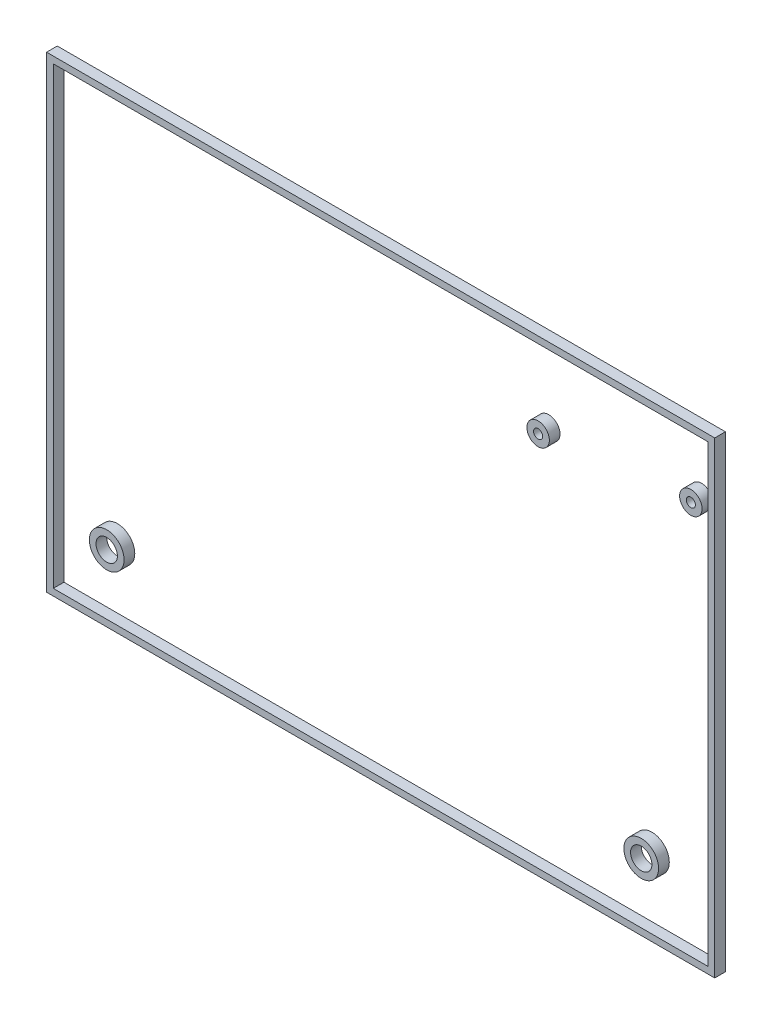
ISO-10303-21;
HEADER;
FILE_DESCRIPTION(('STEP AP214'),'2;1');
FILE_NAME('part.step','',(''),(''),'','','');
FILE_SCHEMA(('AUTOMOTIVE_DESIGN { 1 0 10303 214 1 1 1 1 }'));
ENDSEC;
DATA;
#1=APPLICATION_CONTEXT('core data for automotive mechanical design processes');
#2=APPLICATION_PROTOCOL_DEFINITION('international standard','automotive_design',2000,#1);
#3=PRODUCT_CONTEXT('',#1,'mechanical');
#4=PRODUCT('Part','Part','',(#3));
#5=PRODUCT_RELATED_PRODUCT_CATEGORY('part','',(#4));
#6=PRODUCT_DEFINITION_FORMATION('','',#4);
#7=PRODUCT_DEFINITION_CONTEXT('part definition',#1,'design');
#8=PRODUCT_DEFINITION('design','',#6,#7);
#9=PRODUCT_DEFINITION_SHAPE('','',#8);
#10=(LENGTH_UNIT() NAMED_UNIT(*) SI_UNIT(.MILLI.,.METRE.));
#11=(NAMED_UNIT(*) PLANE_ANGLE_UNIT() SI_UNIT($,.RADIAN.));
#12=(NAMED_UNIT(*) SI_UNIT($,.STERADIAN.) SOLID_ANGLE_UNIT());
#13=UNCERTAINTY_MEASURE_WITH_UNIT(LENGTH_MEASURE(1.E-05),#10,'distance_accuracy_value','');
#14=(GEOMETRIC_REPRESENTATION_CONTEXT(3) GLOBAL_UNCERTAINTY_ASSIGNED_CONTEXT((#13)) GLOBAL_UNIT_ASSIGNED_CONTEXT((#10,
#11,#12)) REPRESENTATION_CONTEXT('',''));
#15=CARTESIAN_POINT('',(0.,0.,0.));
#16=DIRECTION('',(0.,0.,1.));
#17=DIRECTION('',(1.,0.,0.));
#18=AXIS2_PLACEMENT_3D('',#15,#16,#17);
#19=CARTESIAN_POINT('',(115.,-95.,-0.8));
#20=DIRECTION('',(0.,0.,1.));
#21=DIRECTION('',(1.,0.,0.));
#22=AXIS2_PLACEMENT_3D('',#19,#20,#21);
#23=CYLINDRICAL_SURFACE('',#22,1.60000000000001);
#24=CARTESIAN_POINT('',(115.,-95.,-0.8));
#25=DIRECTION('',(0.,0.,1.));
#26=DIRECTION('',(1.,0.,0.));
#27=AXIS2_PLACEMENT_3D('',#24,#25,#26);
#28=CIRCLE('',#27,1.60000000000001);
#29=CARTESIAN_POINT('',(116.6,-95.,-0.8));
#30=VERTEX_POINT('',#29);
#31=EDGE_CURVE('E165',#30,#30,#28,.T.);
#32=ORIENTED_EDGE('',*,*,#31,.F.);
#33=EDGE_LOOP('',(#32));
#34=FACE_BOUND('',#33,.T.);
#35=CARTESIAN_POINT('',(115.,-95.,0.8));
#36=DIRECTION('',(0.,0.,1.));
#37=DIRECTION('',(1.,0.,0.));
#38=AXIS2_PLACEMENT_3D('',#35,#36,#37);
#39=CIRCLE('',#38,1.60000000000001);
#40=CARTESIAN_POINT('',(116.6,-95.,0.8));
#41=VERTEX_POINT('',#40);
#42=EDGE_CURVE('E173',#41,#41,#39,.T.);
#43=ORIENTED_EDGE('',*,*,#42,.T.);
#44=EDGE_LOOP('',(#43));
#45=FACE_BOUND('',#44,.T.);
#46=ADVANCED_FACE('F159',(#34,#45),#23,.F.);
#47=CARTESIAN_POINT('',(115.,-95.,-0.8));
#48=DIRECTION('',(0.,0.,1.));
#49=DIRECTION('',(1.,0.,0.));
#50=AXIS2_PLACEMENT_3D('',#47,#48,#49);
#51=CYLINDRICAL_SURFACE('',#50,2.6);
#52=CARTESIAN_POINT('',(115.,-95.,-0.8));
#53=DIRECTION('',(0.,0.,1.));
#54=DIRECTION('',(1.,0.,0.));
#55=AXIS2_PLACEMENT_3D('',#52,#53,#54);
#56=CIRCLE('',#55,2.6);
#57=CARTESIAN_POINT('',(117.6,-95.,-0.8));
#58=VERTEX_POINT('',#57);
#59=EDGE_CURVE('E12',#58,#58,#56,.T.);
#60=ORIENTED_EDGE('',*,*,#59,.T.);
#61=EDGE_LOOP('',(#60));
#62=FACE_BOUND('',#61,.T.);
#63=CARTESIAN_POINT('',(115.,-95.,0.8));
#64=DIRECTION('',(0.,0.,1.));
#65=DIRECTION('',(1.,0.,0.));
#66=AXIS2_PLACEMENT_3D('',#63,#64,#65);
#67=CIRCLE('',#66,2.6);
#68=CARTESIAN_POINT('',(117.6,-95.,0.8));
#69=VERTEX_POINT('',#68);
#70=EDGE_CURVE('E169',#69,#69,#67,.T.);
#71=ORIENTED_EDGE('',*,*,#70,.F.);
#72=EDGE_LOOP('',(#71));
#73=FACE_BOUND('',#72,.T.);
#74=ADVANCED_FACE('F187',(#62,#73),#51,.T.);
#75=CARTESIAN_POINT('',(0.,0.,-0.8));
#76=DIRECTION('',(0.,0.,1.));
#77=DIRECTION('',(1.,0.,0.));
#78=AXIS2_PLACEMENT_3D('',#75,#76,#77);
#79=PLANE('',#78);
#80=ORIENTED_EDGE('',*,*,#31,.T.);
#81=EDGE_LOOP('',(#80));
#82=FACE_BOUND('',#81,.T.);
#83=ORIENTED_EDGE('',*,*,#59,.F.);
#84=EDGE_LOOP('',(#83));
#85=FACE_BOUND('',#84,.T.);
#86=ADVANCED_FACE('F183',(#82,#85),#79,.F.);
#87=CARTESIAN_POINT('',(0.,0.,0.8));
#88=DIRECTION('',(0.,0.,1.));
#89=DIRECTION('',(1.,0.,0.));
#90=AXIS2_PLACEMENT_3D('',#87,#88,#89);
#91=PLANE('',#90);
#92=ORIENTED_EDGE('',*,*,#42,.F.);
#93=EDGE_LOOP('',(#92));
#94=FACE_BOUND('',#93,.T.);
#95=ORIENTED_EDGE('',*,*,#70,.T.);
#96=EDGE_LOOP('',(#95));
#97=FACE_BOUND('',#96,.T.);
#98=ADVANCED_FACE('F180',(#94,#97),#91,.T.);
#99=CLOSED_SHELL('',(#46,#74,#86,#98));
#100=MANIFOLD_SOLID_BREP('B2',#99);
#101=CARTESIAN_POINT('',(195.,-95.,-0.8));
#102=DIRECTION('',(0.,0.,1.));
#103=DIRECTION('',(1.,0.,0.));
#104=AXIS2_PLACEMENT_3D('',#101,#102,#103);
#105=CYLINDRICAL_SURFACE('',#104,1.59999999999999);
#106=CARTESIAN_POINT('',(195.,-95.,-0.8));
#107=DIRECTION('',(0.,0.,1.));
#108=DIRECTION('',(1.,0.,0.));
#109=AXIS2_PLACEMENT_3D('',#106,#107,#108);
#110=CIRCLE('',#109,1.59999999999999);
#111=CARTESIAN_POINT('',(196.6,-95.,-0.8));
#112=VERTEX_POINT('',#111);
#113=EDGE_CURVE('E236',#112,#112,#110,.T.);
#114=ORIENTED_EDGE('',*,*,#113,.F.);
#115=EDGE_LOOP('',(#114));
#116=FACE_BOUND('',#115,.T.);
#117=CARTESIAN_POINT('',(195.,-95.,0.8));
#118=DIRECTION('',(0.,0.,1.));
#119=DIRECTION('',(1.,0.,0.));
#120=AXIS2_PLACEMENT_3D('',#117,#118,#119);
#121=CIRCLE('',#120,1.59999999999999);
#122=CARTESIAN_POINT('',(196.6,-95.,0.8));
#123=VERTEX_POINT('',#122);
#124=EDGE_CURVE('E244',#123,#123,#121,.T.);
#125=ORIENTED_EDGE('',*,*,#124,.T.);
#126=EDGE_LOOP('',(#125));
#127=FACE_BOUND('',#126,.T.);
#128=ADVANCED_FACE('F230',(#116,#127),#105,.F.);
#129=CARTESIAN_POINT('',(195.,-95.,-0.8));
#130=DIRECTION('',(0.,0.,1.));
#131=DIRECTION('',(1.,0.,0.));
#132=AXIS2_PLACEMENT_3D('',#129,#130,#131);
#133=CYLINDRICAL_SURFACE('',#132,2.59999999999999);
#134=CARTESIAN_POINT('',(195.,-95.,-0.8));
#135=DIRECTION('',(0.,0.,1.));
#136=DIRECTION('',(1.,0.,0.));
#137=AXIS2_PLACEMENT_3D('',#134,#135,#136);
#138=CIRCLE('',#137,2.59999999999999);
#139=CARTESIAN_POINT('',(197.6,-95.,-0.8));
#140=VERTEX_POINT('',#139);
#141=EDGE_CURVE('E158',#140,#140,#138,.T.);
#142=ORIENTED_EDGE('',*,*,#141,.T.);
#143=EDGE_LOOP('',(#142));
#144=FACE_BOUND('',#143,.T.);
#145=CARTESIAN_POINT('',(195.,-95.,0.8));
#146=DIRECTION('',(0.,0.,1.));
#147=DIRECTION('',(1.,0.,0.));
#148=AXIS2_PLACEMENT_3D('',#145,#146,#147);
#149=CIRCLE('',#148,2.59999999999999);
#150=CARTESIAN_POINT('',(197.6,-95.,0.8));
#151=VERTEX_POINT('',#150);
#152=EDGE_CURVE('E240',#151,#151,#149,.T.);
#153=ORIENTED_EDGE('',*,*,#152,.F.);
#154=EDGE_LOOP('',(#153));
#155=FACE_BOUND('',#154,.T.);
#156=ADVANCED_FACE('F258',(#144,#155),#133,.T.);
#157=CARTESIAN_POINT('',(0.,0.,-0.8));
#158=DIRECTION('',(0.,0.,1.));
#159=DIRECTION('',(1.,0.,0.));
#160=AXIS2_PLACEMENT_3D('',#157,#158,#159);
#161=PLANE('',#160);
#162=ORIENTED_EDGE('',*,*,#113,.T.);
#163=EDGE_LOOP('',(#162));
#164=FACE_BOUND('',#163,.T.);
#165=ORIENTED_EDGE('',*,*,#141,.F.);
#166=EDGE_LOOP('',(#165));
#167=FACE_BOUND('',#166,.T.);
#168=ADVANCED_FACE('F254',(#164,#167),#161,.F.);
#169=CARTESIAN_POINT('',(0.,0.,0.8));
#170=DIRECTION('',(0.,0.,1.));
#171=DIRECTION('',(1.,0.,0.));
#172=AXIS2_PLACEMENT_3D('',#169,#170,#171);
#173=PLANE('',#172);
#174=ORIENTED_EDGE('',*,*,#124,.F.);
#175=EDGE_LOOP('',(#174));
#176=FACE_BOUND('',#175,.T.);
#177=ORIENTED_EDGE('',*,*,#152,.T.);
#178=EDGE_LOOP('',(#177));
#179=FACE_BOUND('',#178,.T.);
#180=ADVANCED_FACE('F251',(#176,#179),#173,.T.);
#181=CLOSED_SHELL('',(#128,#156,#168,#180));
#182=MANIFOLD_SOLID_BREP('B7',#181);
#183=CARTESIAN_POINT('',(0.,-104.,-0.8));
#184=DIRECTION('',(0.,-1.,0.));
#185=DIRECTION('',(0.,0.,-1.));
#186=AXIS2_PLACEMENT_3D('',#183,#184,#185);
#187=PLANE('',#186);
#188=DIRECTION('',(0.,0.,1.));
#189=VECTOR('',#188,1.);
#190=CARTESIAN_POINT('',(107.,-104.,-0.8));
#191=LINE('',#190,#189);
#192=CARTESIAN_POINT('',(107.,-104.,-0.8));
#193=VERTEX_POINT('',#192);
#194=CARTESIAN_POINT('',(107.,-104.,0.8));
#195=VERTEX_POINT('',#194);
#196=EDGE_CURVE('E421',#193,#195,#191,.T.);
#197=ORIENTED_EDGE('',*,*,#196,.T.);
#198=DIRECTION('',(1.,0.,0.));
#199=VECTOR('',#198,1.);
#200=CARTESIAN_POINT('',(0.,-104.,0.8));
#201=LINE('',#200,#199);
#202=CARTESIAN_POINT('',(205.,-104.,0.8));
#203=VERTEX_POINT('',#202);
#204=EDGE_CURVE('E390',#195,#203,#201,.T.);
#205=ORIENTED_EDGE('',*,*,#204,.T.);
#206=DIRECTION('',(0.,0.,1.));
#207=VECTOR('',#206,1.);
#208=CARTESIAN_POINT('',(205.,-104.,-0.8));
#209=LINE('',#208,#207);
#210=CARTESIAN_POINT('',(205.,-104.,-0.8));
#211=VERTEX_POINT('',#210);
#212=EDGE_CURVE('E228',#211,#203,#209,.T.);
#213=ORIENTED_EDGE('',*,*,#212,.F.);
#214=DIRECTION('',(1.,0.,0.));
#215=VECTOR('',#214,1.);
#216=CARTESIAN_POINT('',(0.,-104.,-0.8));
#217=LINE('',#216,#215);
#218=EDGE_CURVE('E409',#193,#211,#217,.T.);
#219=ORIENTED_EDGE('',*,*,#218,.F.);
#220=EDGE_LOOP('',(#197,#205,#213,#219));
#221=FACE_BOUND('',#220,.T.);
#222=ADVANCED_FACE('F299',(#221),#187,.F.);
#223=CARTESIAN_POINT('',(205.,0.,-0.8));
#224=DIRECTION('',(1.,0.,0.));
#225=DIRECTION('',(0.,0.,-1.));
#226=AXIS2_PLACEMENT_3D('',#223,#224,#225);
#227=PLANE('',#226);
#228=ORIENTED_EDGE('',*,*,#212,.T.);
#229=DIRECTION('',(0.,1.,0.));
#230=VECTOR('',#229,1.);
#231=CARTESIAN_POINT('',(205.,0.,0.8));
#232=LINE('',#231,#230);
#233=CARTESIAN_POINT('',(205.,-36.,0.8));
#234=VERTEX_POINT('',#233);
#235=EDGE_CURVE('E399',#203,#234,#232,.T.);
#236=ORIENTED_EDGE('',*,*,#235,.T.);
#237=DIRECTION('',(0.,0.,1.));
#238=VECTOR('',#237,1.);
#239=CARTESIAN_POINT('',(205.,-36.,-0.8));
#240=LINE('',#239,#238);
#241=CARTESIAN_POINT('',(205.,-36.,-0.8));
#242=VERTEX_POINT('',#241);
#243=EDGE_CURVE('E308',#242,#234,#240,.T.);
#244=ORIENTED_EDGE('',*,*,#243,.F.);
#245=DIRECTION('',(0.,1.,0.));
#246=VECTOR('',#245,1.);
#247=CARTESIAN_POINT('',(205.,0.,-0.8));
#248=LINE('',#247,#246);
#249=EDGE_CURVE('E315',#211,#242,#248,.T.);
#250=ORIENTED_EDGE('',*,*,#249,.F.);
#251=EDGE_LOOP('',(#228,#236,#244,#250));
#252=FACE_BOUND('',#251,.T.);
#253=ADVANCED_FACE('F444',(#252),#227,.F.);
#254=CARTESIAN_POINT('',(0.,-36.,-0.8));
#255=DIRECTION('',(0.,-1.,0.));
#256=DIRECTION('',(0.,0.,-1.));
#257=AXIS2_PLACEMENT_3D('',#254,#255,#256);
#258=PLANE('',#257);
#259=ORIENTED_EDGE('',*,*,#243,.T.);
#260=DIRECTION('',(1.,0.,0.));
#261=VECTOR('',#260,1.);
#262=CARTESIAN_POINT('',(0.,-36.,0.8));
#263=LINE('',#262,#261);
#264=CARTESIAN_POINT('',(107.,-36.,0.8));
#265=VERTEX_POINT('',#264);
#266=EDGE_CURVE('E396',#265,#234,#263,.T.);
#267=ORIENTED_EDGE('',*,*,#266,.F.);
#268=DIRECTION('',(0.,0.,1.));
#269=VECTOR('',#268,1.);
#270=CARTESIAN_POINT('',(107.,-36.,-0.8));
#271=LINE('',#270,#269);
#272=CARTESIAN_POINT('',(107.,-36.,-0.8));
#273=VERTEX_POINT('',#272);
#274=EDGE_CURVE('E419',#273,#265,#271,.T.);
#275=ORIENTED_EDGE('',*,*,#274,.F.);
#276=DIRECTION('',(1.,0.,0.));
#277=VECTOR('',#276,1.);
#278=CARTESIAN_POINT('',(0.,-36.,-0.8));
#279=LINE('',#278,#277);
#280=EDGE_CURVE('E414',#273,#242,#279,.T.);
#281=ORIENTED_EDGE('',*,*,#280,.T.);
#282=EDGE_LOOP('',(#259,#267,#275,#281));
#283=FACE_BOUND('',#282,.T.);
#284=ADVANCED_FACE('F448',(#283),#258,.T.);
#285=CARTESIAN_POINT('',(0.,-105.,-0.8));
#286=DIRECTION('',(0.,-1.,0.));
#287=DIRECTION('',(0.,0.,-1.));
#288=AXIS2_PLACEMENT_3D('',#285,#286,#287);
#289=PLANE('',#288);
#290=DIRECTION('',(0.,0.,1.));
#291=VECTOR('',#290,1.);
#292=CARTESIAN_POINT('',(206.,-105.,-0.8));
#293=LINE('',#292,#291);
#294=CARTESIAN_POINT('',(206.,-105.,-0.8));
#295=VERTEX_POINT('',#294);
#296=CARTESIAN_POINT('',(206.,-105.,0.8));
#297=VERTEX_POINT('',#296);
#298=EDGE_CURVE('E303',#295,#297,#293,.T.);
#299=ORIENTED_EDGE('',*,*,#298,.T.);
#300=DIRECTION('',(1.,0.,0.));
#301=VECTOR('',#300,1.);
#302=CARTESIAN_POINT('',(0.,-105.,0.8));
#303=LINE('',#302,#301);
#304=CARTESIAN_POINT('',(106.,-105.,0.8));
#305=VERTEX_POINT('',#304);
#306=EDGE_CURVE('E365',#305,#297,#303,.T.);
#307=ORIENTED_EDGE('',*,*,#306,.F.);
#308=DIRECTION('',(0.,0.,1.));
#309=VECTOR('',#308,1.);
#310=CARTESIAN_POINT('',(106.,-105.,-0.8));
#311=LINE('',#310,#309);
#312=CARTESIAN_POINT('',(106.,-105.,-0.8));
#313=VERTEX_POINT('',#312);
#314=EDGE_CURVE('E423',#313,#305,#311,.T.);
#315=ORIENTED_EDGE('',*,*,#314,.F.);
#316=DIRECTION('',(1.,0.,0.));
#317=VECTOR('',#316,1.);
#318=CARTESIAN_POINT('',(0.,-105.,-0.8));
#319=LINE('',#318,#317);
#320=EDGE_CURVE('E368',#313,#295,#319,.T.);
#321=ORIENTED_EDGE('',*,*,#320,.T.);
#322=EDGE_LOOP('',(#299,#307,#315,#321));
#323=FACE_BOUND('',#322,.T.);
#324=ADVANCED_FACE('F301',(#323),#289,.T.);
#325=CARTESIAN_POINT('',(106.,0.,-0.8));
#326=DIRECTION('',(1.,0.,0.));
#327=DIRECTION('',(0.,0.,-1.));
#328=AXIS2_PLACEMENT_3D('',#325,#326,#327);
#329=PLANE('',#328);
#330=ORIENTED_EDGE('',*,*,#314,.T.);
#331=DIRECTION('',(0.,1.,0.));
#332=VECTOR('',#331,1.);
#333=CARTESIAN_POINT('',(106.,0.,0.8));
#334=LINE('',#333,#332);
#335=CARTESIAN_POINT('',(106.,-35.,0.8));
#336=VERTEX_POINT('',#335);
#337=EDGE_CURVE('E385',#305,#336,#334,.T.);
#338=ORIENTED_EDGE('',*,*,#337,.T.);
#339=DIRECTION('',(0.,0.,1.));
#340=VECTOR('',#339,1.);
#341=CARTESIAN_POINT('',(106.,-35.,-0.8));
#342=LINE('',#341,#340);
#343=CARTESIAN_POINT('',(106.,-35.,-0.8));
#344=VERTEX_POINT('',#343);
#345=EDGE_CURVE('E425',#344,#336,#342,.T.);
#346=ORIENTED_EDGE('',*,*,#345,.F.);
#347=DIRECTION('',(0.,1.,0.));
#348=VECTOR('',#347,1.);
#349=CARTESIAN_POINT('',(106.,0.,-0.8));
#350=LINE('',#349,#348);
#351=EDGE_CURVE('E407',#313,#344,#350,.T.);
#352=ORIENTED_EDGE('',*,*,#351,.F.);
#353=EDGE_LOOP('',(#330,#338,#346,#352));
#354=FACE_BOUND('',#353,.T.);
#355=ADVANCED_FACE('F432',(#354),#329,.F.);
#356=CARTESIAN_POINT('',(0.,-35.,-0.8));
#357=DIRECTION('',(0.,-1.,0.));
#358=DIRECTION('',(1.,0.,0.));
#359=AXIS2_PLACEMENT_3D('',#356,#357,#358);
#360=PLANE('',#359);
#361=ORIENTED_EDGE('',*,*,#345,.T.);
#362=DIRECTION('',(1.,0.,0.));
#363=VECTOR('',#362,1.);
#364=CARTESIAN_POINT('',(0.,-35.,0.8));
#365=LINE('',#364,#363);
#366=CARTESIAN_POINT('',(206.,-35.,0.8));
#367=VERTEX_POINT('',#366);
#368=EDGE_CURVE('E380',#336,#367,#365,.T.);
#369=ORIENTED_EDGE('',*,*,#368,.T.);
#370=DIRECTION('',(0.,0.,1.));
#371=VECTOR('',#370,1.);
#372=CARTESIAN_POINT('',(206.,-35.,-0.8));
#373=LINE('',#372,#371);
#374=CARTESIAN_POINT('',(206.,-35.,-0.8));
#375=VERTEX_POINT('',#374);
#376=EDGE_CURVE('E372',#375,#367,#373,.T.);
#377=ORIENTED_EDGE('',*,*,#376,.F.);
#378=DIRECTION('',(1.,0.,0.));
#379=VECTOR('',#378,1.);
#380=CARTESIAN_POINT('',(0.,-35.,-0.8));
#381=LINE('',#380,#379);
#382=EDGE_CURVE('E405',#344,#375,#381,.T.);
#383=ORIENTED_EDGE('',*,*,#382,.F.);
#384=EDGE_LOOP('',(#361,#369,#377,#383));
#385=FACE_BOUND('',#384,.T.);
#386=ADVANCED_FACE('F429',(#385),#360,.F.);
#387=CARTESIAN_POINT('',(206.,0.,-0.8));
#388=DIRECTION('',(1.,0.,0.));
#389=DIRECTION('',(0.,0.,-1.));
#390=AXIS2_PLACEMENT_3D('',#387,#388,#389);
#391=PLANE('',#390);
#392=ORIENTED_EDGE('',*,*,#376,.T.);
#393=DIRECTION('',(0.,1.,0.));
#394=VECTOR('',#393,1.);
#395=CARTESIAN_POINT('',(206.,0.,0.8));
#396=LINE('',#395,#394);
#397=EDGE_CURVE('E374',#297,#367,#396,.T.);
#398=ORIENTED_EDGE('',*,*,#397,.F.);
#399=ORIENTED_EDGE('',*,*,#298,.F.);
#400=DIRECTION('',(0.,1.,0.));
#401=VECTOR('',#400,1.);
#402=CARTESIAN_POINT('',(206.,0.,-0.8));
#403=LINE('',#402,#401);
#404=EDGE_CURVE('E403',#295,#375,#403,.T.);
#405=ORIENTED_EDGE('',*,*,#404,.T.);
#406=EDGE_LOOP('',(#392,#398,#399,#405));
#407=FACE_BOUND('',#406,.T.);
#408=ADVANCED_FACE('F375',(#407),#391,.T.);
#409=CARTESIAN_POINT('',(107.,0.,-0.8));
#410=DIRECTION('',(1.,0.,0.));
#411=DIRECTION('',(0.,0.,-1.));
#412=AXIS2_PLACEMENT_3D('',#409,#410,#411);
#413=PLANE('',#412);
#414=ORIENTED_EDGE('',*,*,#274,.T.);
#415=DIRECTION('',(0.,1.,0.));
#416=VECTOR('',#415,1.);
#417=CARTESIAN_POINT('',(107.,0.,0.8));
#418=LINE('',#417,#416);
#419=EDGE_CURVE('E393',#195,#265,#418,.T.);
#420=ORIENTED_EDGE('',*,*,#419,.F.);
#421=ORIENTED_EDGE('',*,*,#196,.F.);
#422=DIRECTION('',(0.,1.,0.));
#423=VECTOR('',#422,1.);
#424=CARTESIAN_POINT('',(107.,0.,-0.8));
#425=LINE('',#424,#423);
#426=EDGE_CURVE('E411',#193,#273,#425,.T.);
#427=ORIENTED_EDGE('',*,*,#426,.T.);
#428=EDGE_LOOP('',(#414,#420,#421,#427));
#429=FACE_BOUND('',#428,.T.);
#430=ADVANCED_FACE('F436',(#429),#413,.T.);
#431=CARTESIAN_POINT('',(0.,0.,-0.8));
#432=DIRECTION('',(0.,0.,1.));
#433=DIRECTION('',(1.,0.,0.));
#434=AXIS2_PLACEMENT_3D('',#431,#432,#433);
#435=PLANE('',#434);
#436=ORIENTED_EDGE('',*,*,#320,.F.);
#437=ORIENTED_EDGE('',*,*,#351,.T.);
#438=ORIENTED_EDGE('',*,*,#382,.T.);
#439=ORIENTED_EDGE('',*,*,#404,.F.);
#440=EDGE_LOOP('',(#436,#437,#438,#439));
#441=FACE_BOUND('',#440,.T.);
#442=ORIENTED_EDGE('',*,*,#218,.T.);
#443=ORIENTED_EDGE('',*,*,#249,.T.);
#444=ORIENTED_EDGE('',*,*,#280,.F.);
#445=ORIENTED_EDGE('',*,*,#426,.F.);
#446=EDGE_LOOP('',(#442,#443,#444,#445));
#447=FACE_BOUND('',#446,.T.);
#448=ADVANCED_FACE('F434',(#441,#447),#435,.F.);
#449=CARTESIAN_POINT('',(0.,0.,0.8));
#450=DIRECTION('',(0.,0.,1.));
#451=DIRECTION('',(1.,0.,0.));
#452=AXIS2_PLACEMENT_3D('',#449,#450,#451);
#453=PLANE('',#452);
#454=ORIENTED_EDGE('',*,*,#306,.T.);
#455=ORIENTED_EDGE('',*,*,#397,.T.);
#456=ORIENTED_EDGE('',*,*,#368,.F.);
#457=ORIENTED_EDGE('',*,*,#337,.F.);
#458=EDGE_LOOP('',(#454,#455,#456,#457));
#459=FACE_BOUND('',#458,.T.);
#460=ORIENTED_EDGE('',*,*,#204,.F.);
#461=ORIENTED_EDGE('',*,*,#419,.T.);
#462=ORIENTED_EDGE('',*,*,#266,.T.);
#463=ORIENTED_EDGE('',*,*,#235,.F.);
#464=EDGE_LOOP('',(#460,#461,#462,#463));
#465=FACE_BOUND('',#464,.T.);
#466=ADVANCED_FACE('F382',(#459,#465),#453,.T.);
#467=CLOSED_SHELL('',(#222,#253,#284,#324,#355,#386,#408,#430,#448,#466));
#468=MANIFOLD_SOLID_BREP('B153',#467);
#469=CARTESIAN_POINT('',(202.425,-45.142,-0.8));
#470=DIRECTION('',(0.,0.,1.));
#471=DIRECTION('',(1.,0.,0.));
#472=AXIS2_PLACEMENT_3D('',#469,#470,#471);
#473=CYLINDRICAL_SURFACE('',#472,0.680000000000022);
#474=CARTESIAN_POINT('',(202.425,-45.142,-0.8));
#475=DIRECTION('',(0.,0.,1.));
#476=DIRECTION('',(1.,0.,0.));
#477=AXIS2_PLACEMENT_3D('',#474,#475,#476);
#478=CIRCLE('',#477,0.680000000000022);
#479=CARTESIAN_POINT('',(203.105,-45.142,-0.8));
#480=VERTEX_POINT('',#479);
#481=EDGE_CURVE('E541',#480,#480,#478,.T.);
#482=ORIENTED_EDGE('',*,*,#481,.F.);
#483=EDGE_LOOP('',(#482));
#484=FACE_BOUND('',#483,.T.);
#485=CARTESIAN_POINT('',(202.425,-45.142,0.8));
#486=DIRECTION('',(0.,0.,1.));
#487=DIRECTION('',(1.,0.,0.));
#488=AXIS2_PLACEMENT_3D('',#485,#486,#487);
#489=CIRCLE('',#488,0.680000000000022);
#490=CARTESIAN_POINT('',(203.105,-45.142,0.8));
#491=VERTEX_POINT('',#490);
#492=EDGE_CURVE('E549',#491,#491,#489,.T.);
#493=ORIENTED_EDGE('',*,*,#492,.T.);
#494=EDGE_LOOP('',(#493));
#495=FACE_BOUND('',#494,.T.);
#496=ADVANCED_FACE('F535',(#484,#495),#473,.F.);
#497=CARTESIAN_POINT('',(202.425,-45.142,-0.8));
#498=DIRECTION('',(0.,0.,1.));
#499=DIRECTION('',(1.,0.,0.));
#500=AXIS2_PLACEMENT_3D('',#497,#498,#499);
#501=CYLINDRICAL_SURFACE('',#500,1.68000000000001);
#502=CARTESIAN_POINT('',(202.425,-45.142,-0.8));
#503=DIRECTION('',(0.,0.,1.));
#504=DIRECTION('',(1.,0.,0.));
#505=AXIS2_PLACEMENT_3D('',#502,#503,#504);
#506=CIRCLE('',#505,1.68000000000001);
#507=CARTESIAN_POINT('',(204.105,-45.142,-0.8));
#508=VERTEX_POINT('',#507);
#509=EDGE_CURVE('E298',#508,#508,#506,.T.);
#510=ORIENTED_EDGE('',*,*,#509,.T.);
#511=EDGE_LOOP('',(#510));
#512=FACE_BOUND('',#511,.T.);
#513=CARTESIAN_POINT('',(202.425,-45.142,0.8));
#514=DIRECTION('',(0.,0.,1.));
#515=DIRECTION('',(1.,0.,0.));
#516=AXIS2_PLACEMENT_3D('',#513,#514,#515);
#517=CIRCLE('',#516,1.68000000000001);
#518=CARTESIAN_POINT('',(204.105,-45.142,0.8));
#519=VERTEX_POINT('',#518);
#520=EDGE_CURVE('E545',#519,#519,#517,.T.);
#521=ORIENTED_EDGE('',*,*,#520,.F.);
#522=EDGE_LOOP('',(#521));
#523=FACE_BOUND('',#522,.T.);
#524=ADVANCED_FACE('F563',(#512,#523),#501,.T.);
#525=CARTESIAN_POINT('',(0.,0.,-0.8));
#526=DIRECTION('',(0.,0.,1.));
#527=DIRECTION('',(1.,0.,0.));
#528=AXIS2_PLACEMENT_3D('',#525,#526,#527);
#529=PLANE('',#528);
#530=ORIENTED_EDGE('',*,*,#481,.T.);
#531=EDGE_LOOP('',(#530));
#532=FACE_BOUND('',#531,.T.);
#533=ORIENTED_EDGE('',*,*,#509,.F.);
#534=EDGE_LOOP('',(#533));
#535=FACE_BOUND('',#534,.T.);
#536=ADVANCED_FACE('F559',(#532,#535),#529,.F.);
#537=CARTESIAN_POINT('',(0.,0.,0.8));
#538=DIRECTION('',(0.,0.,1.));
#539=DIRECTION('',(1.,0.,0.));
#540=AXIS2_PLACEMENT_3D('',#537,#538,#539);
#541=PLANE('',#540);
#542=ORIENTED_EDGE('',*,*,#492,.F.);
#543=EDGE_LOOP('',(#542));
#544=FACE_BOUND('',#543,.T.);
#545=ORIENTED_EDGE('',*,*,#520,.T.);
#546=EDGE_LOOP('',(#545));
#547=FACE_BOUND('',#546,.T.);
#548=ADVANCED_FACE('F556',(#544,#547),#541,.T.);
#549=CLOSED_SHELL('',(#496,#524,#536,#548));
#550=MANIFOLD_SOLID_BREP('B222',#549);
#551=CARTESIAN_POINT('',(179.565,-47.682,-0.8));
#552=DIRECTION('',(0.,0.,1.));
#553=DIRECTION('',(1.,0.,0.));
#554=AXIS2_PLACEMENT_3D('',#551,#552,#553);
#555=CYLINDRICAL_SURFACE('',#554,0.680000000000022);
#556=CARTESIAN_POINT('',(179.565,-47.682,-0.8));
#557=DIRECTION('',(0.,0.,1.));
#558=DIRECTION('',(1.,0.,0.));
#559=AXIS2_PLACEMENT_3D('',#556,#557,#558);
#560=CIRCLE('',#559,0.680000000000022);
#561=CARTESIAN_POINT('',(180.245,-47.682,-0.8));
#562=VERTEX_POINT('',#561);
#563=EDGE_CURVE('E602',#562,#562,#560,.T.);
#564=ORIENTED_EDGE('',*,*,#563,.F.);
#565=EDGE_LOOP('',(#564));
#566=FACE_BOUND('',#565,.T.);
#567=CARTESIAN_POINT('',(179.565,-47.682,0.8));
#568=DIRECTION('',(0.,0.,1.));
#569=DIRECTION('',(1.,0.,0.));
#570=AXIS2_PLACEMENT_3D('',#567,#568,#569);
#571=CIRCLE('',#570,0.680000000000022);
#572=CARTESIAN_POINT('',(180.245,-47.682,0.8));
#573=VERTEX_POINT('',#572);
#574=EDGE_CURVE('E610',#573,#573,#571,.T.);
#575=ORIENTED_EDGE('',*,*,#574,.T.);
#576=EDGE_LOOP('',(#575));
#577=FACE_BOUND('',#576,.T.);
#578=ADVANCED_FACE('F596',(#566,#577),#555,.F.);
#579=CARTESIAN_POINT('',(179.565,-47.682,-0.8));
#580=DIRECTION('',(0.,0.,1.));
#581=DIRECTION('',(1.,0.,0.));
#582=AXIS2_PLACEMENT_3D('',#579,#580,#581);
#583=CYLINDRICAL_SURFACE('',#582,1.68000000000001);
#584=CARTESIAN_POINT('',(179.565,-47.682,-0.8));
#585=DIRECTION('',(0.,0.,1.));
#586=DIRECTION('',(1.,0.,0.));
#587=AXIS2_PLACEMENT_3D('',#584,#585,#586);
#588=CIRCLE('',#587,1.68000000000001);
#589=CARTESIAN_POINT('',(181.245,-47.682,-0.8));
#590=VERTEX_POINT('',#589);
#591=EDGE_CURVE('E534',#590,#590,#588,.T.);
#592=ORIENTED_EDGE('',*,*,#591,.T.);
#593=EDGE_LOOP('',(#592));
#594=FACE_BOUND('',#593,.T.);
#595=CARTESIAN_POINT('',(179.565,-47.682,0.8));
#596=DIRECTION('',(0.,0.,1.));
#597=DIRECTION('',(1.,0.,0.));
#598=AXIS2_PLACEMENT_3D('',#595,#596,#597);
#599=CIRCLE('',#598,1.68000000000001);
#600=CARTESIAN_POINT('',(181.245,-47.682,0.8));
#601=VERTEX_POINT('',#600);
#602=EDGE_CURVE('E606',#601,#601,#599,.T.);
#603=ORIENTED_EDGE('',*,*,#602,.F.);
#604=EDGE_LOOP('',(#603));
#605=FACE_BOUND('',#604,.T.);
#606=ADVANCED_FACE('F624',(#594,#605),#583,.T.);
#607=CARTESIAN_POINT('',(0.,0.,-0.8));
#608=DIRECTION('',(0.,0.,1.));
#609=DIRECTION('',(1.,0.,0.));
#610=AXIS2_PLACEMENT_3D('',#607,#608,#609);
#611=PLANE('',#610);
#612=ORIENTED_EDGE('',*,*,#563,.T.);
#613=EDGE_LOOP('',(#612));
#614=FACE_BOUND('',#613,.T.);
#615=ORIENTED_EDGE('',*,*,#591,.F.);
#616=EDGE_LOOP('',(#615));
#617=FACE_BOUND('',#616,.T.);
#618=ADVANCED_FACE('F620',(#614,#617),#611,.F.);
#619=CARTESIAN_POINT('',(0.,0.,0.8));
#620=DIRECTION('',(0.,0.,1.));
#621=DIRECTION('',(1.,0.,0.));
#622=AXIS2_PLACEMENT_3D('',#619,#620,#621);
#623=PLANE('',#622);
#624=ORIENTED_EDGE('',*,*,#574,.F.);
#625=EDGE_LOOP('',(#624));
#626=FACE_BOUND('',#625,.T.);
#627=ORIENTED_EDGE('',*,*,#602,.T.);
#628=EDGE_LOOP('',(#627));
#629=FACE_BOUND('',#628,.T.);
#630=ADVANCED_FACE('F617',(#626,#629),#623,.T.);
#631=CLOSED_SHELL('',(#578,#606,#618,#630));
#632=MANIFOLD_SOLID_BREP('B293',#631);
#633=ADVANCED_BREP_SHAPE_REPRESENTATION('',(#18,#100,#182,#468,#550,#632),#14);
#634=SHAPE_DEFINITION_REPRESENTATION(#9,#633);
ENDSEC;
END-ISO-10303-21;
